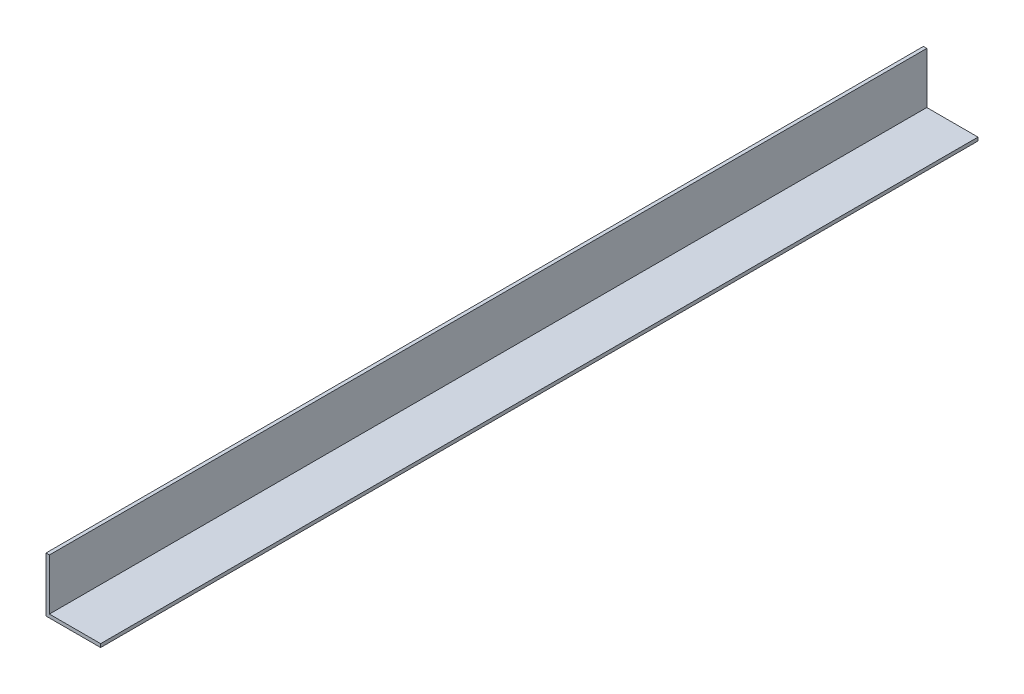
ISO-10303-21;
HEADER;
FILE_DESCRIPTION(('STEP AP214'),'2;1');
FILE_NAME('part.step','',(''),(''),'','','');
FILE_SCHEMA(('AUTOMOTIVE_DESIGN { 1 0 10303 214 1 1 1 1 }'));
ENDSEC;
DATA;
#1=APPLICATION_CONTEXT('core data for automotive mechanical design processes');
#2=APPLICATION_PROTOCOL_DEFINITION('international standard','automotive_design',2000,#1);
#3=PRODUCT_CONTEXT('',#1,'mechanical');
#4=PRODUCT('Part','Part','',(#3));
#5=PRODUCT_RELATED_PRODUCT_CATEGORY('part','',(#4));
#6=PRODUCT_DEFINITION_FORMATION('','',#4);
#7=PRODUCT_DEFINITION_CONTEXT('part definition',#1,'design');
#8=PRODUCT_DEFINITION('design','',#6,#7);
#9=PRODUCT_DEFINITION_SHAPE('','',#8);
#10=(LENGTH_UNIT() NAMED_UNIT(*) SI_UNIT(.MILLI.,.METRE.));
#11=(NAMED_UNIT(*) PLANE_ANGLE_UNIT() SI_UNIT($,.RADIAN.));
#12=(NAMED_UNIT(*) SI_UNIT($,.STERADIAN.) SOLID_ANGLE_UNIT());
#13=UNCERTAINTY_MEASURE_WITH_UNIT(LENGTH_MEASURE(1.E-05),#10,'distance_accuracy_value','');
#14=(GEOMETRIC_REPRESENTATION_CONTEXT(3) GLOBAL_UNCERTAINTY_ASSIGNED_CONTEXT((#13)) GLOBAL_UNIT_ASSIGNED_CONTEXT((#10,
#11,#12)) REPRESENTATION_CONTEXT('',''));
#15=CARTESIAN_POINT('',(0.,0.,0.));
#16=DIRECTION('',(0.,0.,1.));
#17=DIRECTION('',(1.,0.,0.));
#18=AXIS2_PLACEMENT_3D('',#15,#16,#17);
#19=CARTESIAN_POINT('',(50.8,0.,-407.9875));
#20=DIRECTION('',(1.,0.,0.));
#21=DIRECTION('',(0.,0.,-1.));
#22=AXIS2_PLACEMENT_3D('',#19,#20,#21);
#23=PLANE('',#22);
#24=DIRECTION('',(0.,1.,0.));
#25=VECTOR('',#24,1.);
#26=CARTESIAN_POINT('',(50.8,0.,407.9875));
#27=LINE('',#26,#25);
#28=CARTESIAN_POINT('',(50.8,0.,407.9875));
#29=VERTEX_POINT('',#28);
#30=CARTESIAN_POINT('',(50.8,3.175,407.9875));
#31=VERTEX_POINT('',#30);
#32=EDGE_CURVE('E121',#29,#31,#27,.T.);
#33=ORIENTED_EDGE('',*,*,#32,.F.);
#34=DIRECTION('',(0.,0.,-1.));
#35=VECTOR('',#34,1.);
#36=CARTESIAN_POINT('',(50.8,0.,-407.9875));
#37=LINE('',#36,#35);
#38=CARTESIAN_POINT('',(50.8,0.,-407.9875));
#39=VERTEX_POINT('',#38);
#40=EDGE_CURVE('E90',#39,#29,#37,.F.);
#41=ORIENTED_EDGE('',*,*,#40,.F.);
#42=DIRECTION('',(0.,1.,0.));
#43=VECTOR('',#42,1.);
#44=CARTESIAN_POINT('',(50.8,0.,-407.9875));
#45=LINE('',#44,#43);
#46=CARTESIAN_POINT('',(50.8,3.175,-407.9875));
#47=VERTEX_POINT('',#46);
#48=EDGE_CURVE('E87',#39,#47,#45,.T.);
#49=ORIENTED_EDGE('',*,*,#48,.T.);
#50=DIRECTION('',(0.,0.,1.));
#51=VECTOR('',#50,1.);
#52=CARTESIAN_POINT('',(50.8,3.175,-407.9875));
#53=LINE('',#52,#51);
#54=EDGE_CURVE('E36',#31,#47,#53,.F.);
#55=ORIENTED_EDGE('',*,*,#54,.F.);
#56=EDGE_LOOP('',(#33,#41,#49,#55));
#57=FACE_BOUND('',#56,.T.);
#58=ADVANCED_FACE('F33',(#57),#23,.T.);
#59=CARTESIAN_POINT('',(50.8,3.175,-407.9875));
#60=DIRECTION('',(0.,1.,0.));
#61=DIRECTION('',(0.,0.,1.));
#62=AXIS2_PLACEMENT_3D('',#59,#60,#61);
#63=PLANE('',#62);
#64=DIRECTION('',(1.,0.,0.));
#65=VECTOR('',#64,1.);
#66=CARTESIAN_POINT('',(0.,3.175,407.9875));
#67=LINE('',#66,#65);
#68=CARTESIAN_POINT('',(3.175,3.175,407.9875));
#69=VERTEX_POINT('',#68);
#70=EDGE_CURVE('E98',#31,#69,#67,.F.);
#71=ORIENTED_EDGE('',*,*,#70,.F.);
#72=ORIENTED_EDGE('',*,*,#54,.T.);
#73=DIRECTION('',(1.,0.,0.));
#74=VECTOR('',#73,1.);
#75=CARTESIAN_POINT('',(0.,3.175,-407.9875));
#76=LINE('',#75,#74);
#77=CARTESIAN_POINT('',(3.175,3.175,-407.9875));
#78=VERTEX_POINT('',#77);
#79=EDGE_CURVE('E82',#47,#78,#76,.F.);
#80=ORIENTED_EDGE('',*,*,#79,.T.);
#81=DIRECTION('',(0.,0.,-1.));
#82=VECTOR('',#81,1.);
#83=CARTESIAN_POINT('',(3.175,3.175,-407.9875));
#84=LINE('',#83,#82);
#85=EDGE_CURVE('E94',#69,#78,#84,.T.);
#86=ORIENTED_EDGE('',*,*,#85,.F.);
#87=EDGE_LOOP('',(#71,#72,#80,#86));
#88=FACE_BOUND('',#87,.T.);
#89=ADVANCED_FACE('F96',(#88),#63,.T.);
#90=CARTESIAN_POINT('',(3.175,3.175,-407.9875));
#91=DIRECTION('',(1.,0.,0.));
#92=DIRECTION('',(0.,0.,-1.));
#93=AXIS2_PLACEMENT_3D('',#90,#91,#92);
#94=PLANE('',#93);
#95=DIRECTION('',(0.,1.,0.));
#96=VECTOR('',#95,1.);
#97=CARTESIAN_POINT('',(3.175,0.,407.9875));
#98=LINE('',#97,#96);
#99=CARTESIAN_POINT('',(3.175,50.8,407.9875));
#100=VERTEX_POINT('',#99);
#101=EDGE_CURVE('E112',#69,#100,#98,.T.);
#102=ORIENTED_EDGE('',*,*,#101,.F.);
#103=ORIENTED_EDGE('',*,*,#85,.T.);
#104=DIRECTION('',(0.,1.,0.));
#105=VECTOR('',#104,1.);
#106=CARTESIAN_POINT('',(3.175,0.,-407.9875));
#107=LINE('',#106,#105);
#108=CARTESIAN_POINT('',(3.175,50.8,-407.9875));
#109=VERTEX_POINT('',#108);
#110=EDGE_CURVE('E103',#78,#109,#107,.T.);
#111=ORIENTED_EDGE('',*,*,#110,.T.);
#112=DIRECTION('',(0.,0.,1.));
#113=VECTOR('',#112,1.);
#114=CARTESIAN_POINT('',(3.175,50.8,-407.9875));
#115=LINE('',#114,#113);
#116=EDGE_CURVE('E114',#100,#109,#115,.F.);
#117=ORIENTED_EDGE('',*,*,#116,.F.);
#118=EDGE_LOOP('',(#102,#103,#111,#117));
#119=FACE_BOUND('',#118,.T.);
#120=ADVANCED_FACE('F110',(#119),#94,.T.);
#121=CARTESIAN_POINT('',(0.,0.,-407.9875));
#122=DIRECTION('',(0.,0.,1.));
#123=DIRECTION('',(1.,0.,0.));
#124=AXIS2_PLACEMENT_3D('',#121,#122,#123);
#125=PLANE('',#124);
#126=ORIENTED_EDGE('',*,*,#110,.F.);
#127=ORIENTED_EDGE('',*,*,#79,.F.);
#128=ORIENTED_EDGE('',*,*,#48,.F.);
#129=DIRECTION('',(1.,0.,0.));
#130=VECTOR('',#129,1.);
#131=CARTESIAN_POINT('',(0.,0.,-407.9875));
#132=LINE('',#131,#130);
#133=CARTESIAN_POINT('',(0.,0.,-407.9875));
#134=VERTEX_POINT('',#133);
#135=EDGE_CURVE('E105',#134,#39,#132,.T.);
#136=ORIENTED_EDGE('',*,*,#135,.F.);
#137=DIRECTION('',(0.,1.,0.));
#138=VECTOR('',#137,1.);
#139=CARTESIAN_POINT('',(0.,50.8,-407.9875));
#140=LINE('',#139,#138);
#141=CARTESIAN_POINT('',(0.,50.8,-407.9875));
#142=VERTEX_POINT('',#141);
#143=EDGE_CURVE('E132',#142,#134,#140,.F.);
#144=ORIENTED_EDGE('',*,*,#143,.F.);
#145=DIRECTION('',(1.,0.,0.));
#146=VECTOR('',#145,1.);
#147=CARTESIAN_POINT('',(3.175,50.8,-407.9875));
#148=LINE('',#147,#146);
#149=EDGE_CURVE('E117',#109,#142,#148,.F.);
#150=ORIENTED_EDGE('',*,*,#149,.F.);
#151=EDGE_LOOP('',(#126,#127,#128,#136,#144,#150));
#152=FACE_BOUND('',#151,.T.);
#153=ADVANCED_FACE('F101',(#152),#125,.F.);
#154=CARTESIAN_POINT('',(0.,0.,-407.9875));
#155=DIRECTION('',(0.,-1.,0.));
#156=DIRECTION('',(0.,0.,-1.));
#157=AXIS2_PLACEMENT_3D('',#154,#155,#156);
#158=PLANE('',#157);
#159=DIRECTION('',(1.,0.,0.));
#160=VECTOR('',#159,1.);
#161=CARTESIAN_POINT('',(0.,0.,407.9875));
#162=LINE('',#161,#160);
#163=CARTESIAN_POINT('',(0.,0.,407.9875));
#164=VERTEX_POINT('',#163);
#165=EDGE_CURVE('E123',#164,#29,#162,.T.);
#166=ORIENTED_EDGE('',*,*,#165,.F.);
#167=DIRECTION('',(0.,0.,1.));
#168=VECTOR('',#167,1.);
#169=CARTESIAN_POINT('',(0.,0.,-407.9875));
#170=LINE('',#169,#168);
#171=EDGE_CURVE('E131',#134,#164,#170,.T.);
#172=ORIENTED_EDGE('',*,*,#171,.F.);
#173=ORIENTED_EDGE('',*,*,#135,.T.);
#174=ORIENTED_EDGE('',*,*,#40,.T.);
#175=EDGE_LOOP('',(#166,#172,#173,#174));
#176=FACE_BOUND('',#175,.T.);
#177=ADVANCED_FACE('F130',(#176),#158,.T.);
#178=CARTESIAN_POINT('',(0.,0.,407.9875));
#179=DIRECTION('',(0.,0.,1.));
#180=DIRECTION('',(1.,0.,0.));
#181=AXIS2_PLACEMENT_3D('',#178,#179,#180);
#182=PLANE('',#181);
#183=DIRECTION('',(1.,0.,0.));
#184=VECTOR('',#183,1.);
#185=CARTESIAN_POINT('',(3.175,50.8,407.9875));
#186=LINE('',#185,#184);
#187=CARTESIAN_POINT('',(0.,50.8,407.9875));
#188=VERTEX_POINT('',#187);
#189=EDGE_CURVE('E138',#188,#100,#186,.T.);
#190=ORIENTED_EDGE('',*,*,#189,.F.);
#191=DIRECTION('',(0.,1.,0.));
#192=VECTOR('',#191,1.);
#193=CARTESIAN_POINT('',(0.,50.8,407.9875));
#194=LINE('',#193,#192);
#195=EDGE_CURVE('E42',#164,#188,#194,.T.);
#196=ORIENTED_EDGE('',*,*,#195,.F.);
#197=ORIENTED_EDGE('',*,*,#165,.T.);
#198=ORIENTED_EDGE('',*,*,#32,.T.);
#199=ORIENTED_EDGE('',*,*,#70,.T.);
#200=ORIENTED_EDGE('',*,*,#101,.T.);
#201=EDGE_LOOP('',(#190,#196,#197,#198,#199,#200));
#202=FACE_BOUND('',#201,.T.);
#203=ADVANCED_FACE('F119',(#202),#182,.T.);
#204=CARTESIAN_POINT('',(3.175,50.8,-407.9875));
#205=DIRECTION('',(0.,1.,0.));
#206=DIRECTION('',(0.,0.,1.));
#207=AXIS2_PLACEMENT_3D('',#204,#205,#206);
#208=PLANE('',#207);
#209=ORIENTED_EDGE('',*,*,#189,.T.);
#210=ORIENTED_EDGE('',*,*,#116,.T.);
#211=ORIENTED_EDGE('',*,*,#149,.T.);
#212=DIRECTION('',(0.,0.,1.));
#213=VECTOR('',#212,1.);
#214=CARTESIAN_POINT('',(0.,50.8,-407.9875));
#215=LINE('',#214,#213);
#216=EDGE_CURVE('E11',#188,#142,#215,.F.);
#217=ORIENTED_EDGE('',*,*,#216,.F.);
#218=EDGE_LOOP('',(#209,#210,#211,#217));
#219=FACE_BOUND('',#218,.T.);
#220=ADVANCED_FACE('F137',(#219),#208,.T.);
#221=CARTESIAN_POINT('',(0.,50.8,-407.9875));
#222=DIRECTION('',(-1.,0.,0.));
#223=DIRECTION('',(0.,0.,1.));
#224=AXIS2_PLACEMENT_3D('',#221,#222,#223);
#225=PLANE('',#224);
#226=ORIENTED_EDGE('',*,*,#143,.T.);
#227=ORIENTED_EDGE('',*,*,#171,.T.);
#228=ORIENTED_EDGE('',*,*,#195,.T.);
#229=ORIENTED_EDGE('',*,*,#216,.T.);
#230=EDGE_LOOP('',(#226,#227,#228,#229));
#231=FACE_BOUND('',#230,.T.);
#232=ADVANCED_FACE('F139',(#231),#225,.T.);
#233=CLOSED_SHELL('',(#58,#89,#120,#153,#177,#203,#220,#232));
#234=MANIFOLD_SOLID_BREP('B2',#233);
#235=ADVANCED_BREP_SHAPE_REPRESENTATION('',(#18,#234),#14);
#236=SHAPE_DEFINITION_REPRESENTATION(#9,#235);
ENDSEC;
END-ISO-10303-21;
